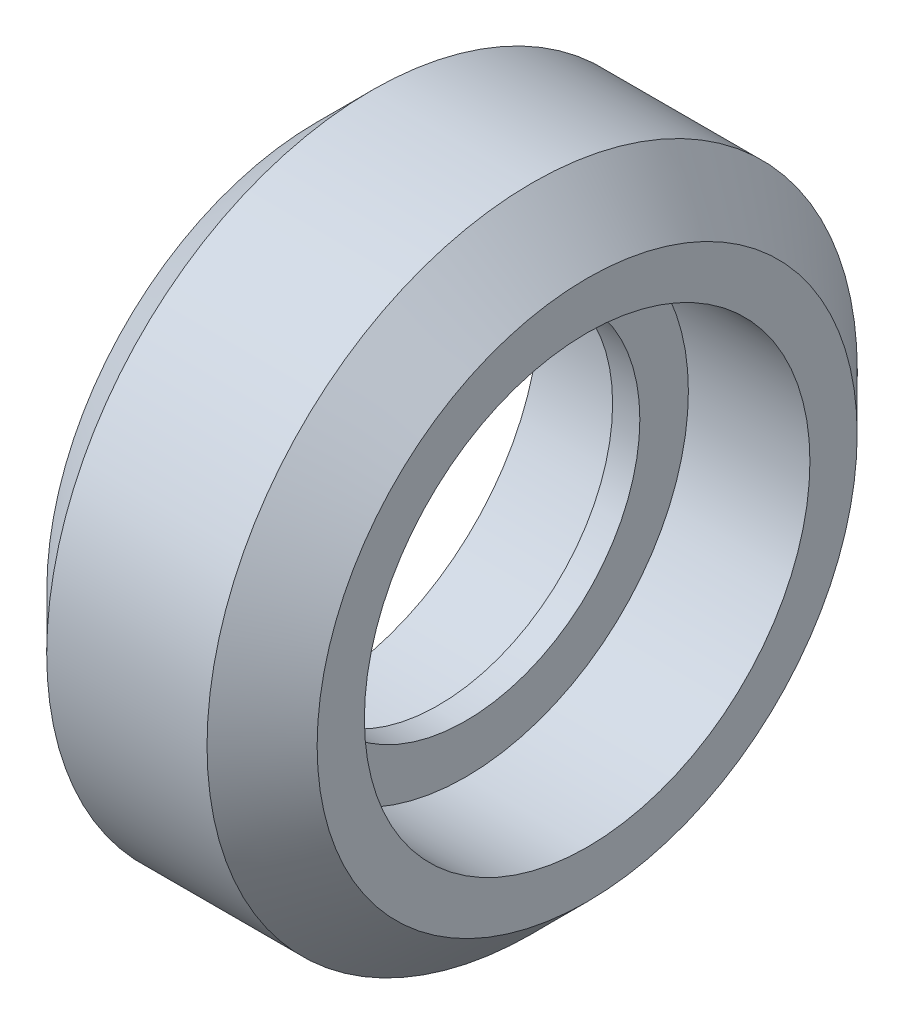
ISO-10303-21;
HEADER;
FILE_DESCRIPTION(('STEP AP214'),'2;1');
FILE_NAME('part.step','',(''),(''),'','','');
FILE_SCHEMA(('AUTOMOTIVE_DESIGN { 1 0 10303 214 1 1 1 1 }'));
ENDSEC;
DATA;
#1=APPLICATION_CONTEXT('core data for automotive mechanical design processes');
#2=APPLICATION_PROTOCOL_DEFINITION('international standard','automotive_design',2000,#1);
#3=PRODUCT_CONTEXT('',#1,'mechanical');
#4=PRODUCT('Part','Part','',(#3));
#5=PRODUCT_RELATED_PRODUCT_CATEGORY('part','',(#4));
#6=PRODUCT_DEFINITION_FORMATION('','',#4);
#7=PRODUCT_DEFINITION_CONTEXT('part definition',#1,'design');
#8=PRODUCT_DEFINITION('design','',#6,#7);
#9=PRODUCT_DEFINITION_SHAPE('','',#8);
#10=(LENGTH_UNIT() NAMED_UNIT(*) SI_UNIT(.MILLI.,.METRE.));
#11=(NAMED_UNIT(*) PLANE_ANGLE_UNIT() SI_UNIT($,.RADIAN.));
#12=(NAMED_UNIT(*) SI_UNIT($,.STERADIAN.) SOLID_ANGLE_UNIT());
#13=UNCERTAINTY_MEASURE_WITH_UNIT(LENGTH_MEASURE(1.E-05),#10,'distance_accuracy_value','');
#14=(GEOMETRIC_REPRESENTATION_CONTEXT(3) GLOBAL_UNCERTAINTY_ASSIGNED_CONTEXT((#13)) GLOBAL_UNIT_ASSIGNED_CONTEXT((#10,
#11,#12)) REPRESENTATION_CONTEXT('',''));
#15=CARTESIAN_POINT('',(0.,0.,0.));
#16=DIRECTION('',(0.,0.,1.));
#17=DIRECTION('',(1.,0.,0.));
#18=AXIS2_PLACEMENT_3D('',#15,#16,#17);
#19=CARTESIAN_POINT('',(4.96517261219795,0.,0.));
#20=DIRECTION('',(1.,0.,0.));
#21=DIRECTION('',(0.,0.,-1.));
#22=AXIS2_PLACEMENT_3D('',#19,#20,#21);
#23=CYLINDRICAL_SURFACE('',#22,6.40116414389959);
#24=CARTESIAN_POINT('',(5.46517261219794,0.,0.));
#25=DIRECTION('',(1.,0.,0.));
#26=DIRECTION('',(0.,0.,-1.));
#27=AXIS2_PLACEMENT_3D('',#24,#25,#26);
#28=CIRCLE('',#27,6.40116414389959);
#29=CARTESIAN_POINT('',(5.46517261219794,0.,-6.40116414389959));
#30=VERTEX_POINT('',#29);
#31=EDGE_CURVE('E17',#30,#30,#28,.F.);
#32=ORIENTED_EDGE('',*,*,#31,.F.);
#33=EDGE_LOOP('',(#32));
#34=FACE_BOUND('',#33,.T.);
#35=CARTESIAN_POINT('',(4.46517261219795,0.,0.));
#36=DIRECTION('',(1.,0.,0.));
#37=DIRECTION('',(0.,0.,-1.));
#38=AXIS2_PLACEMENT_3D('',#35,#36,#37);
#39=CIRCLE('',#38,6.40116414389959);
#40=CARTESIAN_POINT('',(4.46517261219795,0.,-6.40116414389959));
#41=VERTEX_POINT('',#40);
#42=EDGE_CURVE('E49',#41,#41,#39,.T.);
#43=ORIENTED_EDGE('',*,*,#42,.F.);
#44=EDGE_LOOP('',(#43));
#45=FACE_BOUND('',#44,.T.);
#46=ADVANCED_FACE('F14',(#34,#45),#23,.F.);
#47=CARTESIAN_POINT('',(5.46517261219794,7.29266414389959,0.));
#48=DIRECTION('',(1.,0.,0.));
#49=DIRECTION('',(0.,0.,-1.));
#50=AXIS2_PLACEMENT_3D('',#47,#48,#49);
#51=PLANE('',#50);
#52=CARTESIAN_POINT('',(5.46517261219794,0.,0.));
#53=DIRECTION('',(1.,0.,0.));
#54=DIRECTION('',(0.,0.,-1.));
#55=AXIS2_PLACEMENT_3D('',#52,#53,#54);
#56=CIRCLE('',#55,8.18416414389959);
#57=CARTESIAN_POINT('',(5.46517261219794,0.,-8.18416414389959));
#58=VERTEX_POINT('',#57);
#59=EDGE_CURVE('E47',#58,#58,#56,.T.);
#60=ORIENTED_EDGE('',*,*,#59,.T.);
#61=EDGE_LOOP('',(#60));
#62=FACE_BOUND('',#61,.T.);
#63=ORIENTED_EDGE('',*,*,#31,.T.);
#64=EDGE_LOOP('',(#63));
#65=FACE_BOUND('',#64,.T.);
#66=ADVANCED_FACE('F56',(#62,#65),#51,.T.);
#67=CARTESIAN_POINT('',(4.46517261219795,7.29266414389959,0.));
#68=DIRECTION('',(-1.,0.,0.));
#69=DIRECTION('',(0.,0.,1.));
#70=AXIS2_PLACEMENT_3D('',#67,#68,#69);
#71=PLANE('',#70);
#72=ORIENTED_EDGE('',*,*,#42,.T.);
#73=EDGE_LOOP('',(#72));
#74=FACE_BOUND('',#73,.T.);
#75=CARTESIAN_POINT('',(4.46517261219795,0.,0.));
#76=DIRECTION('',(1.,0.,0.));
#77=DIRECTION('',(0.,0.,-1.));
#78=AXIS2_PLACEMENT_3D('',#75,#76,#77);
#79=CIRCLE('',#78,8.18416414389959);
#80=CARTESIAN_POINT('',(4.46517261219795,0.,-8.18416414389959));
#81=VERTEX_POINT('',#80);
#82=EDGE_CURVE('E44',#81,#81,#79,.F.);
#83=ORIENTED_EDGE('',*,*,#82,.T.);
#84=EDGE_LOOP('',(#83));
#85=FACE_BOUND('',#84,.T.);
#86=ADVANCED_FACE('F64',(#74,#85),#71,.T.);
#87=CARTESIAN_POINT('',(7.69775891829691,0.,0.));
#88=DIRECTION('',(1.,0.,0.));
#89=DIRECTION('',(0.,0.,-1.));
#90=AXIS2_PLACEMENT_3D('',#87,#88,#89);
#91=CYLINDRICAL_SURFACE('',#90,8.18416414389959);
#92=CARTESIAN_POINT('',(9.93034522439587,0.,0.));
#93=DIRECTION('',(1.,0.,0.));
#94=DIRECTION('',(0.,0.,-1.));
#95=AXIS2_PLACEMENT_3D('',#92,#93,#94);
#96=CIRCLE('',#95,8.18416414389959);
#97=CARTESIAN_POINT('',(9.93034522439587,0.,-8.18416414389959));
#98=VERTEX_POINT('',#97);
#99=EDGE_CURVE('E41',#98,#98,#96,.F.);
#100=ORIENTED_EDGE('',*,*,#99,.F.);
#101=EDGE_LOOP('',(#100));
#102=FACE_BOUND('',#101,.T.);
#103=ORIENTED_EDGE('',*,*,#59,.F.);
#104=EDGE_LOOP('',(#103));
#105=FACE_BOUND('',#104,.T.);
#106=ADVANCED_FACE('F92',(#102,#105),#91,.F.);
#107=CARTESIAN_POINT('',(2.23258630609898,0.,0.));
#108=DIRECTION('',(1.,0.,0.));
#109=DIRECTION('',(0.,0.,-1.));
#110=AXIS2_PLACEMENT_3D('',#107,#108,#109);
#111=CYLINDRICAL_SURFACE('',#110,8.18416414389959);
#112=ORIENTED_EDGE('',*,*,#82,.F.);
#113=EDGE_LOOP('',(#112));
#114=FACE_BOUND('',#113,.T.);
#115=CARTESIAN_POINT('',(0.,0.,0.));
#116=DIRECTION('',(1.,0.,0.));
#117=DIRECTION('',(0.,0.,-1.));
#118=AXIS2_PLACEMENT_3D('',#115,#116,#117);
#119=CIRCLE('',#118,8.18416414389959);
#120=CARTESIAN_POINT('',(0.,0.,-8.18416414389959));
#121=VERTEX_POINT('',#120);
#122=EDGE_CURVE('E38',#121,#121,#119,.T.);
#123=ORIENTED_EDGE('',*,*,#122,.F.);
#124=EDGE_LOOP('',(#123));
#125=FACE_BOUND('',#124,.T.);
#126=ADVANCED_FACE('F88',(#114,#125),#111,.F.);
#127=CARTESIAN_POINT('',(9.93034522439587,9.05216837804874,0.));
#128=DIRECTION('',(1.,0.,0.));
#129=DIRECTION('',(0.,0.,-1.));
#130=AXIS2_PLACEMENT_3D('',#127,#128,#129);
#131=PLANE('',#130);
#132=CARTESIAN_POINT('',(9.9303452243959,0.,0.));
#133=DIRECTION('',(-1.,0.,0.));
#134=DIRECTION('',(0.,0.,1.));
#135=AXIS2_PLACEMENT_3D('',#132,#133,#134);
#136=CIRCLE('',#135,9.92017261219793);
#137=CARTESIAN_POINT('',(9.9303452243959,0.,9.92017261219793));
#138=VERTEX_POINT('',#137);
#139=EDGE_CURVE('E35',#138,#138,#136,.T.);
#140=ORIENTED_EDGE('',*,*,#139,.F.);
#141=EDGE_LOOP('',(#140));
#142=FACE_BOUND('',#141,.T.);
#143=ORIENTED_EDGE('',*,*,#99,.T.);
#144=EDGE_LOOP('',(#143));
#145=FACE_BOUND('',#144,.T.);
#146=ADVANCED_FACE('F84',(#142,#145),#131,.T.);
#147=CARTESIAN_POINT('',(0.,9.05216837804874,0.));
#148=DIRECTION('',(-1.,0.,0.));
#149=DIRECTION('',(0.,-1.,0.));
#150=AXIS2_PLACEMENT_3D('',#147,#148,#149);
#151=PLANE('',#150);
#152=ORIENTED_EDGE('',*,*,#122,.T.);
#153=EDGE_LOOP('',(#152));
#154=FACE_BOUND('',#153,.T.);
#155=CARTESIAN_POINT('',(0.,0.,0.));
#156=DIRECTION('',(1.,0.,0.));
#157=DIRECTION('',(0.,0.,-1.));
#158=AXIS2_PLACEMENT_3D('',#155,#156,#157);
#159=CIRCLE('',#158,9.92017261219792);
#160=CARTESIAN_POINT('',(0.,0.,-9.92017261219792));
#161=VERTEX_POINT('',#160);
#162=EDGE_CURVE('E26',#161,#161,#159,.T.);
#163=ORIENTED_EDGE('',*,*,#162,.F.);
#164=EDGE_LOOP('',(#163));
#165=FACE_BOUND('',#164,.T.);
#166=ADVANCED_FACE('F80',(#154,#165),#151,.T.);
#167=CARTESIAN_POINT('',(7.91017261219797,0.,0.));
#168=DIRECTION('',(-1.,0.,0.));
#169=DIRECTION('',(0.,0.,1.));
#170=AXIS2_PLACEMENT_3D('',#167,#168,#169);
#171=CONICAL_SURFACE('',#170,11.945,0.786548910875698);
#172=CARTESIAN_POINT('',(7.91017261219794,0.,0.));
#173=DIRECTION('',(1.,0.,0.));
#174=DIRECTION('',(0.,0.,-1.));
#175=AXIS2_PLACEMENT_3D('',#172,#173,#174);
#176=CIRCLE('',#175,11.945);
#177=CARTESIAN_POINT('',(7.91017261219794,0.,-11.945));
#178=VERTEX_POINT('',#177);
#179=EDGE_CURVE('E21',#178,#178,#176,.F.);
#180=ORIENTED_EDGE('',*,*,#179,.F.);
#181=EDGE_LOOP('',(#180));
#182=FACE_BOUND('',#181,.T.);
#183=ORIENTED_EDGE('',*,*,#139,.T.);
#184=EDGE_LOOP('',(#183));
#185=FACE_BOUND('',#184,.T.);
#186=ADVANCED_FACE('F73',(#182,#185),#171,.T.);
#187=CARTESIAN_POINT('',(2.02017261219792,0.,0.));
#188=DIRECTION('',(1.,0.,0.));
#189=DIRECTION('',(0.,0.,-1.));
#190=AXIS2_PLACEMENT_3D('',#187,#188,#189);
#191=CONICAL_SURFACE('',#190,11.945,0.7865489108757);
#192=ORIENTED_EDGE('',*,*,#162,.T.);
#193=EDGE_LOOP('',(#192));
#194=FACE_BOUND('',#193,.T.);
#195=CARTESIAN_POINT('',(2.02017261219794,0.,0.));
#196=DIRECTION('',(1.,0.,0.));
#197=DIRECTION('',(0.,0.,-1.));
#198=AXIS2_PLACEMENT_3D('',#195,#196,#197);
#199=CIRCLE('',#198,11.945);
#200=CARTESIAN_POINT('',(2.02017261219794,0.,-11.945));
#201=VERTEX_POINT('',#200);
#202=EDGE_CURVE('E10',#201,#201,#199,.T.);
#203=ORIENTED_EDGE('',*,*,#202,.F.);
#204=EDGE_LOOP('',(#203));
#205=FACE_BOUND('',#204,.T.);
#206=ADVANCED_FACE('F68',(#194,#205),#191,.T.);
#207=CARTESIAN_POINT('',(4.96517261219794,0.,0.));
#208=DIRECTION('',(1.,0.,0.));
#209=DIRECTION('',(0.,0.,-1.));
#210=AXIS2_PLACEMENT_3D('',#207,#208,#209);
#211=CYLINDRICAL_SURFACE('',#210,11.945);
#212=ORIENTED_EDGE('',*,*,#202,.T.);
#213=EDGE_LOOP('',(#212));
#214=FACE_BOUND('',#213,.T.);
#215=ORIENTED_EDGE('',*,*,#179,.T.);
#216=EDGE_LOOP('',(#215));
#217=FACE_BOUND('',#216,.T.);
#218=ADVANCED_FACE('F66',(#214,#217),#211,.T.);
#219=CLOSED_SHELL('',(#46,#66,#86,#106,#126,#146,#166,#186,#206,#218));
#220=MANIFOLD_SOLID_BREP('B1',#219);
#221=ADVANCED_BREP_SHAPE_REPRESENTATION('',(#18,#220),#14);
#222=SHAPE_DEFINITION_REPRESENTATION(#9,#221);
ENDSEC;
END-ISO-10303-21;
